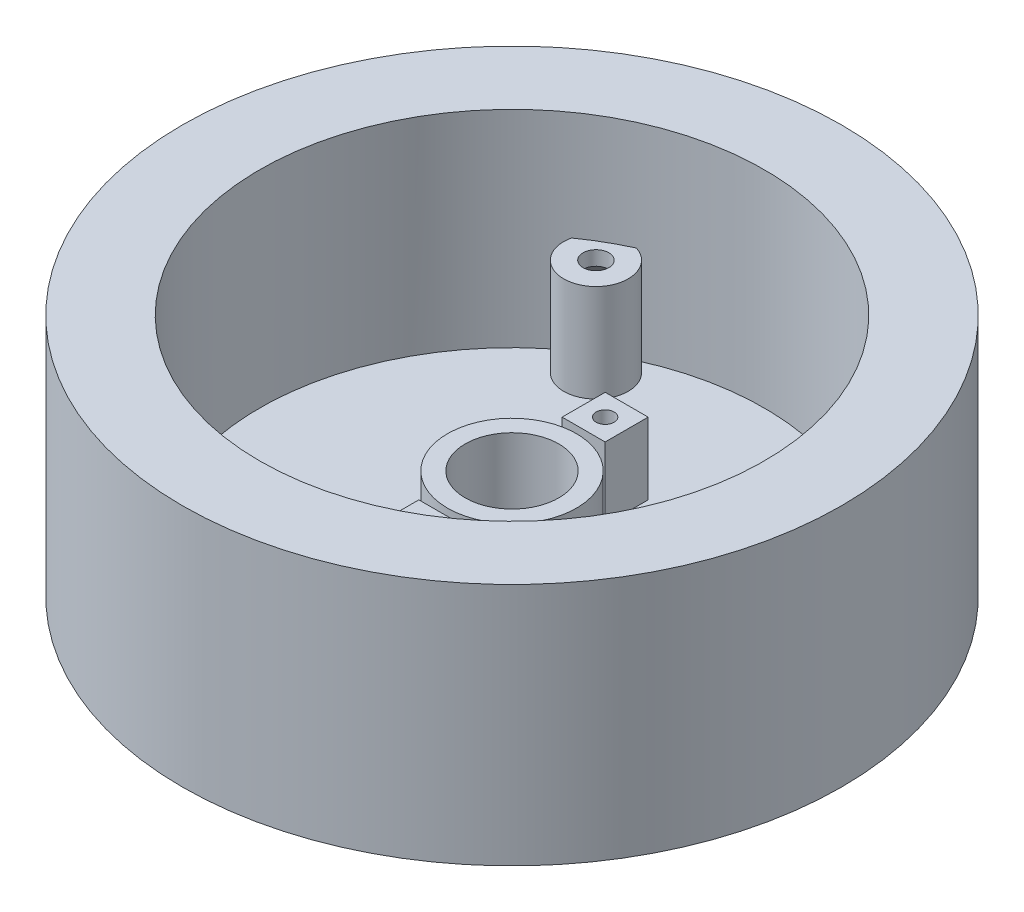
ISO-10303-21;
HEADER;
FILE_DESCRIPTION(('STEP AP214'),'2;1');
FILE_NAME('part.step','',(''),(''),'','','');
FILE_SCHEMA(('AUTOMOTIVE_DESIGN { 1 0 10303 214 1 1 1 1 }'));
ENDSEC;
DATA;
#1=APPLICATION_CONTEXT('core data for automotive mechanical design processes');
#2=APPLICATION_PROTOCOL_DEFINITION('international standard','automotive_design',2000,#1);
#3=PRODUCT_CONTEXT('',#1,'mechanical');
#4=PRODUCT('Part','Part','',(#3));
#5=PRODUCT_RELATED_PRODUCT_CATEGORY('part','',(#4));
#6=PRODUCT_DEFINITION_FORMATION('','',#4);
#7=PRODUCT_DEFINITION_CONTEXT('part definition',#1,'design');
#8=PRODUCT_DEFINITION('design','',#6,#7);
#9=PRODUCT_DEFINITION_SHAPE('','',#8);
#10=(LENGTH_UNIT() NAMED_UNIT(*) SI_UNIT(.MILLI.,.METRE.));
#11=(NAMED_UNIT(*) PLANE_ANGLE_UNIT() SI_UNIT($,.RADIAN.));
#12=(NAMED_UNIT(*) SI_UNIT($,.STERADIAN.) SOLID_ANGLE_UNIT());
#13=UNCERTAINTY_MEASURE_WITH_UNIT(LENGTH_MEASURE(1.E-05),#10,'distance_accuracy_value','');
#14=(GEOMETRIC_REPRESENTATION_CONTEXT(3) GLOBAL_UNCERTAINTY_ASSIGNED_CONTEXT((#13)) GLOBAL_UNIT_ASSIGNED_CONTEXT((#10,
#11,#12)) REPRESENTATION_CONTEXT('',''));
#15=CARTESIAN_POINT('',(0.,0.,0.));
#16=DIRECTION('',(0.,0.,1.));
#17=DIRECTION('',(1.,0.,0.));
#18=AXIS2_PLACEMENT_3D('',#15,#16,#17);
#19=CARTESIAN_POINT('',(0.,74.6999133448223,0.));
#20=DIRECTION('',(0.,-1.,0.));
#21=DIRECTION('',(0.,0.,-1.));
#22=AXIS2_PLACEMENT_3D('',#19,#20,#21);
#23=CYLINDRICAL_SURFACE('',#22,17.6);
#24=CARTESIAN_POINT('',(0.,17.,0.));
#25=DIRECTION('',(0.,1.,0.));
#26=DIRECTION('',(0.,0.,1.));
#27=AXIS2_PLACEMENT_3D('',#24,#25,#26);
#28=CIRCLE('',#27,17.6);
#29=CARTESIAN_POINT('',(0.,17.,17.6));
#30=VERTEX_POINT('',#29);
#31=EDGE_CURVE('E228',#30,#30,#28,.T.);
#32=ORIENTED_EDGE('',*,*,#31,.T.);
#33=EDGE_LOOP('',(#32));
#34=FACE_BOUND('',#33,.T.);
#35=CARTESIAN_POINT('',(0.,9.40000000000001,0.));
#36=DIRECTION('',(0.,1.,0.));
#37=DIRECTION('',(0.,0.,1.));
#38=AXIS2_PLACEMENT_3D('',#35,#36,#37);
#39=CIRCLE('',#38,17.6);
#40=CARTESIAN_POINT('',(-10.1961599828031,9.4,14.3456725741627));
#41=VERTEX_POINT('',#40);
#42=CARTESIAN_POINT('',(-7.32563689219481,9.4,16.0029698532402));
#43=VERTEX_POINT('',#42);
#44=EDGE_CURVE('E12',#41,#43,#39,.T.);
#45=ORIENTED_EDGE('',*,*,#44,.F.);
#46=DIRECTION('',(0.,-1.,0.));
#47=VECTOR('',#46,1.);
#48=CARTESIAN_POINT('',(-10.1961599828031,6.,14.3456725741627));
#49=LINE('',#48,#47);
#50=CARTESIAN_POINT('',(-10.1961599828031,2.6,14.3456725741627));
#51=VERTEX_POINT('',#50);
#52=EDGE_CURVE('E149',#41,#51,#49,.T.);
#53=ORIENTED_EDGE('',*,*,#52,.T.);
#54=CARTESIAN_POINT('',(0.,2.6,0.));
#55=DIRECTION('',(0.,1.,0.));
#56=DIRECTION('',(0.,0.,1.));
#57=AXIS2_PLACEMENT_3D('',#54,#55,#56);
#58=CIRCLE('',#57,17.6);
#59=CARTESIAN_POINT('',(-10.1961599828047,2.6,-14.3456725741616));
#60=VERTEX_POINT('',#59);
#61=EDGE_CURVE('E159',#51,#60,#58,.F.);
#62=ORIENTED_EDGE('',*,*,#61,.T.);
#63=DIRECTION('',(0.,-1.,0.));
#64=VECTOR('',#63,1.);
#65=CARTESIAN_POINT('',(-10.1961599828047,6.,-14.3456725741616));
#66=LINE('',#65,#64);
#67=CARTESIAN_POINT('',(-10.1961599828047,9.4,-14.3456725741616));
#68=VERTEX_POINT('',#67);
#69=EDGE_CURVE('E180',#60,#68,#66,.F.);
#70=ORIENTED_EDGE('',*,*,#69,.T.);
#71=CARTESIAN_POINT('',(0.,9.40000000000001,0.));
#72=DIRECTION('',(0.,1.,0.));
#73=DIRECTION('',(0.,0.,1.));
#74=AXIS2_PLACEMENT_3D('',#71,#72,#73);
#75=CIRCLE('',#74,17.6);
#76=CARTESIAN_POINT('',(-7.32563689219546,9.4,-16.0029698532399));
#77=VERTEX_POINT('',#76);
#78=EDGE_CURVE('E178',#77,#68,#75,.T.);
#79=ORIENTED_EDGE('',*,*,#78,.F.);
#80=DIRECTION('',(0.,-1.,0.));
#81=VECTOR('',#80,1.);
#82=CARTESIAN_POINT('',(-7.32563689219548,6.,-16.0029698532399));
#83=LINE('',#82,#81);
#84=CARTESIAN_POINT('',(-7.32563689219546,2.6,-16.0029698532399));
#85=VERTEX_POINT('',#84);
#86=EDGE_CURVE('E184',#77,#85,#83,.T.);
#87=ORIENTED_EDGE('',*,*,#86,.T.);
#88=CARTESIAN_POINT('',(17.5217968749998,2.6,-1.65729727908006));
#89=VERTEX_POINT('',#88);
#90=EDGE_CURVE('E171',#85,#89,#58,.F.);
#91=ORIENTED_EDGE('',*,*,#90,.T.);
#92=DIRECTION('',(0.,-1.,0.));
#93=VECTOR('',#92,1.);
#94=CARTESIAN_POINT('',(17.5217968749998,6.,-1.65729727908007));
#95=LINE('',#94,#93);
#96=CARTESIAN_POINT('',(17.5217968749998,9.4,-1.65729727908008));
#97=VERTEX_POINT('',#96);
#98=EDGE_CURVE('E70',#89,#97,#95,.F.);
#99=ORIENTED_EDGE('',*,*,#98,.T.);
#100=CARTESIAN_POINT('',(0.,9.40000000000001,0.));
#101=DIRECTION('',(0.,1.,0.));
#102=DIRECTION('',(0.,0.,1.));
#103=AXIS2_PLACEMENT_3D('',#100,#101,#102);
#104=CIRCLE('',#103,17.6);
#105=CARTESIAN_POINT('',(17.5217968750001,9.4,1.65729727907769));
#106=VERTEX_POINT('',#105);
#107=EDGE_CURVE('E54',#106,#97,#104,.T.);
#108=ORIENTED_EDGE('',*,*,#107,.F.);
#109=DIRECTION('',(0.,-1.,0.));
#110=VECTOR('',#109,1.);
#111=CARTESIAN_POINT('',(17.5217968750001,6.,1.65729727907768));
#112=LINE('',#111,#110);
#113=CARTESIAN_POINT('',(17.5217968750001,2.6,1.65729727907768));
#114=VERTEX_POINT('',#113);
#115=EDGE_CURVE('E222',#106,#114,#112,.T.);
#116=ORIENTED_EDGE('',*,*,#115,.T.);
#117=CARTESIAN_POINT('',(-7.32563689219484,2.6,16.0029698532402));
#118=VERTEX_POINT('',#117);
#119=EDGE_CURVE('E168',#114,#118,#58,.F.);
#120=ORIENTED_EDGE('',*,*,#119,.T.);
#121=DIRECTION('',(0.,-1.,0.));
#122=VECTOR('',#121,1.);
#123=CARTESIAN_POINT('',(-7.32563689219483,6.,16.0029698532402));
#124=LINE('',#123,#122);
#125=EDGE_CURVE('E62',#118,#43,#124,.F.);
#126=ORIENTED_EDGE('',*,*,#125,.T.);
#127=EDGE_LOOP('',(#45,#53,#62,#70,#79,#87,#91,#99,#108,#116,#120,#126));
#128=FACE_BOUND('',#127,.T.);
#129=ADVANCED_FACE('F45',(#34,#128),#23,.F.);
#130=CARTESIAN_POINT('',(0.,2.6,0.));
#131=DIRECTION('',(0.,1.,0.));
#132=DIRECTION('',(0.,0.,1.));
#133=AXIS2_PLACEMENT_3D('',#130,#131,#132);
#134=PLANE('',#133);
#135=DIRECTION('',(0.,0.,-1.));
#136=VECTOR('',#135,1.);
#137=CARTESIAN_POINT('',(1.5,2.6,0.));
#138=LINE('',#137,#136);
#139=CARTESIAN_POINT('',(1.5,2.6,7.99795173081583));
#140=VERTEX_POINT('',#139);
#141=CARTESIAN_POINT('',(1.5,2.6,4.99795173081583));
#142=VERTEX_POINT('',#141);
#143=EDGE_CURVE('E286',#140,#142,#138,.T.);
#144=ORIENTED_EDGE('',*,*,#143,.F.);
#145=DIRECTION('',(1.,0.,0.));
#146=VECTOR('',#145,1.);
#147=CARTESIAN_POINT('',(0.,2.6,7.99795173081583));
#148=LINE('',#147,#146);
#149=CARTESIAN_POINT('',(-1.5,2.6,7.99795173081583));
#150=VERTEX_POINT('',#149);
#151=EDGE_CURVE('E267',#150,#140,#148,.T.);
#152=ORIENTED_EDGE('',*,*,#151,.F.);
#153=DIRECTION('',(0.,0.,-1.));
#154=VECTOR('',#153,1.);
#155=CARTESIAN_POINT('',(-1.5,2.6,0.));
#156=LINE('',#155,#154);
#157=CARTESIAN_POINT('',(-1.5,2.6,4.99795173081583));
#158=VERTEX_POINT('',#157);
#159=EDGE_CURVE('E272',#150,#158,#156,.T.);
#160=ORIENTED_EDGE('',*,*,#159,.T.);
#161=DIRECTION('',(1.,0.,0.));
#162=VECTOR('',#161,1.);
#163=CARTESIAN_POINT('',(0.,2.6,4.99795173081583));
#164=LINE('',#163,#162);
#165=EDGE_CURVE('E289',#158,#142,#164,.T.);
#166=ORIENTED_EDGE('',*,*,#165,.T.);
#167=EDGE_LOOP('',(#144,#152,#160,#166));
#168=FACE_BOUND('',#167,.T.);
#169=CARTESIAN_POINT('',(0.,2.6,0.));
#170=DIRECTION('',(0.,1.,0.));
#171=DIRECTION('',(0.,0.,1.));
#172=AXIS2_PLACEMENT_3D('',#169,#170,#171);
#173=CIRCLE('',#172,4.5);
#174=CARTESIAN_POINT('',(0.,2.6,4.5));
#175=VERTEX_POINT('',#174);
#176=EDGE_CURVE('E313',#175,#175,#173,.T.);
#177=ORIENTED_EDGE('',*,*,#176,.F.);
#178=EDGE_LOOP('',(#177));
#179=FACE_BOUND('',#178,.T.);
#180=DIRECTION('',(1.,0.,0.));
#181=VECTOR('',#180,1.);
#182=CARTESIAN_POINT('',(0.,2.6,-7.99795173081583));
#183=LINE('',#182,#181);
#184=CARTESIAN_POINT('',(-1.5,2.6,-7.99795173081583));
#185=VERTEX_POINT('',#184);
#186=CARTESIAN_POINT('',(1.5,2.6,-7.99795173081583));
#187=VERTEX_POINT('',#186);
#188=EDGE_CURVE('E231',#185,#187,#183,.T.);
#189=ORIENTED_EDGE('',*,*,#188,.T.);
#190=DIRECTION('',(0.,0.,1.));
#191=VECTOR('',#190,1.);
#192=CARTESIAN_POINT('',(1.5,2.6,0.));
#193=LINE('',#192,#191);
#194=CARTESIAN_POINT('',(1.5,2.6,-4.99795173081583));
#195=VERTEX_POINT('',#194);
#196=EDGE_CURVE('E236',#187,#195,#193,.T.);
#197=ORIENTED_EDGE('',*,*,#196,.T.);
#198=DIRECTION('',(1.,0.,0.));
#199=VECTOR('',#198,1.);
#200=CARTESIAN_POINT('',(0.,2.6,-4.99795173081583));
#201=LINE('',#200,#199);
#202=CARTESIAN_POINT('',(-1.5,2.6,-4.99795173081583));
#203=VERTEX_POINT('',#202);
#204=EDGE_CURVE('E252',#203,#195,#201,.T.);
#205=ORIENTED_EDGE('',*,*,#204,.F.);
#206=DIRECTION('',(0.,0.,1.));
#207=VECTOR('',#206,1.);
#208=CARTESIAN_POINT('',(-1.5,2.6,0.));
#209=LINE('',#208,#207);
#210=EDGE_CURVE('E249',#185,#203,#209,.T.);
#211=ORIENTED_EDGE('',*,*,#210,.F.);
#212=EDGE_LOOP('',(#189,#197,#205,#211));
#213=FACE_BOUND('',#212,.T.);
#214=ORIENTED_EDGE('',*,*,#61,.F.);
#215=CARTESIAN_POINT('',(-7.99999999999875,2.6,13.8564064605511));
#216=DIRECTION('',(0.,1.,0.));
#217=DIRECTION('',(0.,0.,1.));
#218=AXIS2_PLACEMENT_3D('',#215,#216,#217);
#219=CIRCLE('',#218,2.25);
#220=EDGE_CURVE('E146',#118,#51,#219,.T.);
#221=ORIENTED_EDGE('',*,*,#220,.F.);
#222=ORIENTED_EDGE('',*,*,#119,.F.);
#223=CARTESIAN_POINT('',(16.0000000000006,2.6,-1.09033358239092E-12));
#224=DIRECTION('',(0.,1.,0.));
#225=DIRECTION('',(0.,0.,1.));
#226=AXIS2_PLACEMENT_3D('',#223,#224,#225);
#227=CIRCLE('',#226,2.25);
#228=EDGE_CURVE('E188',#114,#89,#227,.F.);
#229=ORIENTED_EDGE('',*,*,#228,.T.);
#230=ORIENTED_EDGE('',*,*,#90,.F.);
#231=CARTESIAN_POINT('',(-8.00000000000007,2.6,-13.856406460551));
#232=DIRECTION('',(0.,1.,0.));
#233=DIRECTION('',(0.,0.,1.));
#234=AXIS2_PLACEMENT_3D('',#231,#232,#233);
#235=CIRCLE('',#234,2.25);
#236=EDGE_CURVE('E166',#60,#85,#235,.T.);
#237=ORIENTED_EDGE('',*,*,#236,.F.);
#238=EDGE_LOOP('',(#214,#221,#222,#229,#230,#237));
#239=FACE_BOUND('',#238,.T.);
#240=ADVANCED_FACE('F163',(#168,#179,#213,#239),#134,.T.);
#241=CARTESIAN_POINT('',(0.,17.,0.));
#242=DIRECTION('',(0.,-1.,0.));
#243=DIRECTION('',(0.,0.,-1.));
#244=AXIS2_PLACEMENT_3D('',#241,#242,#243);
#245=CYLINDRICAL_SURFACE('',#244,23.);
#246=CARTESIAN_POINT('',(0.,17.,0.));
#247=DIRECTION('',(0.,1.,0.));
#248=DIRECTION('',(0.,0.,1.));
#249=AXIS2_PLACEMENT_3D('',#246,#247,#248);
#250=CIRCLE('',#249,23.);
#251=CARTESIAN_POINT('',(0.,17.,23.));
#252=VERTEX_POINT('',#251);
#253=EDGE_CURVE('E169',#252,#252,#250,.T.);
#254=ORIENTED_EDGE('',*,*,#253,.F.);
#255=EDGE_LOOP('',(#254));
#256=FACE_BOUND('',#255,.T.);
#257=CARTESIAN_POINT('',(0.,0.,0.));
#258=DIRECTION('',(0.,1.,0.));
#259=DIRECTION('',(0.,0.,1.));
#260=AXIS2_PLACEMENT_3D('',#257,#258,#259);
#261=CIRCLE('',#260,23.);
#262=CARTESIAN_POINT('',(0.,0.,23.));
#263=VERTEX_POINT('',#262);
#264=EDGE_CURVE('E173',#263,#263,#261,.T.);
#265=ORIENTED_EDGE('',*,*,#264,.T.);
#266=EDGE_LOOP('',(#265));
#267=FACE_BOUND('',#266,.T.);
#268=ADVANCED_FACE('F47',(#256,#267),#245,.T.);
#269=CARTESIAN_POINT('',(0.,17.,0.));
#270=DIRECTION('',(0.,1.,0.));
#271=DIRECTION('',(0.,0.,1.));
#272=AXIS2_PLACEMENT_3D('',#269,#270,#271);
#273=PLANE('',#272);
#274=ORIENTED_EDGE('',*,*,#253,.T.);
#275=EDGE_LOOP('',(#274));
#276=FACE_BOUND('',#275,.T.);
#277=ORIENTED_EDGE('',*,*,#31,.F.);
#278=EDGE_LOOP('',(#277));
#279=FACE_BOUND('',#278,.T.);
#280=ADVANCED_FACE('F327',(#276,#279),#273,.T.);
#281=CARTESIAN_POINT('',(0.,0.,0.));
#282=DIRECTION('',(0.,1.,0.));
#283=DIRECTION('',(0.,0.,1.));
#284=AXIS2_PLACEMENT_3D('',#281,#282,#283);
#285=PLANE('',#284);
#286=CARTESIAN_POINT('',(-7.99999999999987,0.,13.8564064605511));
#287=DIRECTION('',(0.,-1.,0.));
#288=DIRECTION('',(0.,0.,-1.));
#289=AXIS2_PLACEMENT_3D('',#286,#287,#288);
#290=CIRCLE('',#289,1.8);
#291=CARTESIAN_POINT('',(-7.99999999999987,0.,12.0564064605511));
#292=VERTEX_POINT('',#291);
#293=EDGE_CURVE('E786',#292,#292,#290,.T.);
#294=ORIENTED_EDGE('',*,*,#293,.F.);
#295=EDGE_LOOP('',(#294));
#296=FACE_BOUND('',#295,.T.);
#297=CARTESIAN_POINT('',(-8.00000000000007,0.,-13.856406460551));
#298=DIRECTION('',(0.,-1.,0.));
#299=DIRECTION('',(0.,0.,-1.));
#300=AXIS2_PLACEMENT_3D('',#297,#298,#299);
#301=CIRCLE('',#300,1.8);
#302=CARTESIAN_POINT('',(-8.00000000000007,0.,-15.656406460551));
#303=VERTEX_POINT('',#302);
#304=EDGE_CURVE('E209',#303,#303,#301,.T.);
#305=ORIENTED_EDGE('',*,*,#304,.F.);
#306=EDGE_LOOP('',(#305));
#307=FACE_BOUND('',#306,.T.);
#308=CARTESIAN_POINT('',(16.,0.,0.));
#309=DIRECTION('',(0.,-1.,0.));
#310=DIRECTION('',(0.,0.,-1.));
#311=AXIS2_PLACEMENT_3D('',#308,#309,#310);
#312=CIRCLE('',#311,1.8);
#313=CARTESIAN_POINT('',(16.,0.,-1.8));
#314=VERTEX_POINT('',#313);
#315=EDGE_CURVE('E196',#314,#314,#312,.T.);
#316=ORIENTED_EDGE('',*,*,#315,.F.);
#317=EDGE_LOOP('',(#316));
#318=FACE_BOUND('',#317,.T.);
#319=CARTESIAN_POINT('',(0.,0.,-6.49795173081583));
#320=DIRECTION('',(0.,-1.,0.));
#321=DIRECTION('',(0.,0.,-1.));
#322=AXIS2_PLACEMENT_3D('',#319,#320,#321);
#323=CIRCLE('',#322,0.624999999999988);
#324=CARTESIAN_POINT('',(0.,0.,-7.12295173081582));
#325=VERTEX_POINT('',#324);
#326=EDGE_CURVE('E303',#325,#325,#323,.T.);
#327=ORIENTED_EDGE('',*,*,#326,.F.);
#328=EDGE_LOOP('',(#327));
#329=FACE_BOUND('',#328,.T.);
#330=CARTESIAN_POINT('',(0.,0.,6.49795173081583));
#331=DIRECTION('',(0.,-1.,0.));
#332=DIRECTION('',(0.,0.,-1.));
#333=AXIS2_PLACEMENT_3D('',#330,#331,#332);
#334=CIRCLE('',#333,0.624999999999988);
#335=CARTESIAN_POINT('',(0.,0.,5.87295173081584));
#336=VERTEX_POINT('',#335);
#337=EDGE_CURVE('E306',#336,#336,#334,.T.);
#338=ORIENTED_EDGE('',*,*,#337,.F.);
#339=EDGE_LOOP('',(#338));
#340=FACE_BOUND('',#339,.T.);
#341=CARTESIAN_POINT('',(0.,0.,0.));
#342=DIRECTION('',(0.,1.,0.));
#343=DIRECTION('',(0.,0.,1.));
#344=AXIS2_PLACEMENT_3D('',#341,#342,#343);
#345=CIRCLE('',#344,3.265);
#346=CARTESIAN_POINT('',(0.,0.,3.265));
#347=VERTEX_POINT('',#346);
#348=EDGE_CURVE('E310',#347,#347,#345,.T.);
#349=ORIENTED_EDGE('',*,*,#348,.T.);
#350=EDGE_LOOP('',(#349));
#351=FACE_BOUND('',#350,.T.);
#352=ORIENTED_EDGE('',*,*,#264,.F.);
#353=EDGE_LOOP('',(#352));
#354=FACE_BOUND('',#353,.T.);
#355=ADVANCED_FACE('F324',(#296,#307,#318,#329,#340,#351,#354),#285,.F.);
#356=CARTESIAN_POINT('',(0.,7.6,0.));
#357=DIRECTION('',(0.,-1.,0.));
#358=DIRECTION('',(0.,0.,-1.));
#359=AXIS2_PLACEMENT_3D('',#356,#357,#358);
#360=CYLINDRICAL_SURFACE('',#359,4.5);
#361=CARTESIAN_POINT('',(0.,7.6,0.));
#362=DIRECTION('',(0.,1.,0.));
#363=DIRECTION('',(0.,0.,1.));
#364=AXIS2_PLACEMENT_3D('',#361,#362,#363);
#365=CIRCLE('',#364,4.5);
#366=CARTESIAN_POINT('',(0.,7.6,4.5));
#367=VERTEX_POINT('',#366);
#368=EDGE_CURVE('E316',#367,#367,#365,.T.);
#369=ORIENTED_EDGE('',*,*,#368,.F.);
#370=EDGE_LOOP('',(#369));
#371=FACE_BOUND('',#370,.T.);
#372=ORIENTED_EDGE('',*,*,#176,.T.);
#373=EDGE_LOOP('',(#372));
#374=FACE_BOUND('',#373,.T.);
#375=ADVANCED_FACE('F326',(#371,#374),#360,.T.);
#376=CARTESIAN_POINT('',(0.,7.6,0.));
#377=DIRECTION('',(0.,1.,0.));
#378=DIRECTION('',(0.,0.,1.));
#379=AXIS2_PLACEMENT_3D('',#376,#377,#378);
#380=PLANE('',#379);
#381=CARTESIAN_POINT('',(0.,7.6,0.));
#382=DIRECTION('',(0.,1.,0.));
#383=DIRECTION('',(0.,0.,1.));
#384=AXIS2_PLACEMENT_3D('',#381,#382,#383);
#385=CIRCLE('',#384,3.265);
#386=CARTESIAN_POINT('',(0.,7.6,3.265));
#387=VERTEX_POINT('',#386);
#388=EDGE_CURVE('E309',#387,#387,#385,.T.);
#389=ORIENTED_EDGE('',*,*,#388,.F.);
#390=EDGE_LOOP('',(#389));
#391=FACE_BOUND('',#390,.T.);
#392=ORIENTED_EDGE('',*,*,#368,.T.);
#393=EDGE_LOOP('',(#392));
#394=FACE_BOUND('',#393,.T.);
#395=ADVANCED_FACE('F333',(#391,#394),#380,.T.);
#396=CARTESIAN_POINT('',(0.,0.,0.));
#397=DIRECTION('',(0.,1.,0.));
#398=DIRECTION('',(0.,0.,1.));
#399=AXIS2_PLACEMENT_3D('',#396,#397,#398);
#400=CYLINDRICAL_SURFACE('',#399,3.265);
#401=CARTESIAN_POINT('',(0.,0.,3.265));
#402=CARTESIAN_POINT('',(0.,0.0791666666666666,3.265));
#403=CARTESIAN_POINT('',(0.,0.158333333333333,3.265));
#404=CARTESIAN_POINT('',(0.,0.316666666666667,3.265));
#405=CARTESIAN_POINT('',(0.,0.395833333333333,3.265));
#406=CARTESIAN_POINT('',(0.,0.554166666666667,3.265));
#407=CARTESIAN_POINT('',(0.,0.633333333333333,3.265));
#408=CARTESIAN_POINT('',(0.,0.791666666666667,3.265));
#409=CARTESIAN_POINT('',(0.,0.870833333333333,3.265));
#410=CARTESIAN_POINT('',(0.,1.02916666666667,3.265));
#411=CARTESIAN_POINT('',(0.,1.10833333333333,3.265));
#412=CARTESIAN_POINT('',(0.,1.26666666666667,3.265));
#413=CARTESIAN_POINT('',(0.,1.34583333333333,3.265));
#414=CARTESIAN_POINT('',(0.,1.50416666666667,3.265));
#415=CARTESIAN_POINT('',(0.,1.58333333333333,3.265));
#416=CARTESIAN_POINT('',(0.,1.74166666666667,3.265));
#417=CARTESIAN_POINT('',(0.,1.82083333333333,3.265));
#418=CARTESIAN_POINT('',(0.,1.97916666666667,3.265));
#419=CARTESIAN_POINT('',(0.,2.05833333333333,3.265));
#420=CARTESIAN_POINT('',(0.,2.21666666666667,3.265));
#421=CARTESIAN_POINT('',(0.,2.29583333333333,3.265));
#422=CARTESIAN_POINT('',(0.,2.45416666666667,3.265));
#423=CARTESIAN_POINT('',(0.,2.53333333333333,3.265));
#424=CARTESIAN_POINT('',(0.,2.69166666666667,3.265));
#425=CARTESIAN_POINT('',(0.,2.77083333333333,3.265));
#426=CARTESIAN_POINT('',(0.,2.92916666666667,3.265));
#427=CARTESIAN_POINT('',(0.,3.00833333333333,3.265));
#428=CARTESIAN_POINT('',(0.,3.16666666666667,3.265));
#429=CARTESIAN_POINT('',(0.,3.24583333333333,3.265));
#430=CARTESIAN_POINT('',(0.,3.40416666666667,3.265));
#431=CARTESIAN_POINT('',(0.,3.48333333333333,3.265));
#432=CARTESIAN_POINT('',(0.,3.64166666666667,3.265));
#433=CARTESIAN_POINT('',(0.,3.72083333333333,3.265));
#434=CARTESIAN_POINT('',(0.,3.87916666666667,3.265));
#435=CARTESIAN_POINT('',(0.,3.95833333333333,3.265));
#436=CARTESIAN_POINT('',(0.,4.11666666666667,3.265));
#437=CARTESIAN_POINT('',(0.,4.19583333333333,3.265));
#438=CARTESIAN_POINT('',(0.,4.35416666666667,3.265));
#439=CARTESIAN_POINT('',(0.,4.43333333333333,3.265));
#440=CARTESIAN_POINT('',(0.,4.59166666666667,3.265));
#441=CARTESIAN_POINT('',(0.,4.67083333333333,3.265));
#442=CARTESIAN_POINT('',(0.,4.82916666666667,3.265));
#443=CARTESIAN_POINT('',(0.,4.90833333333333,3.265));
#444=CARTESIAN_POINT('',(0.,5.06666666666667,3.265));
#445=CARTESIAN_POINT('',(0.,5.14583333333333,3.265));
#446=CARTESIAN_POINT('',(0.,5.30416666666667,3.265));
#447=CARTESIAN_POINT('',(0.,5.38333333333333,3.265));
#448=CARTESIAN_POINT('',(0.,5.54166666666667,3.265));
#449=CARTESIAN_POINT('',(0.,5.62083333333333,3.265));
#450=CARTESIAN_POINT('',(0.,5.77916666666667,3.265));
#451=CARTESIAN_POINT('',(0.,5.85833333333333,3.265));
#452=CARTESIAN_POINT('',(0.,6.01666666666667,3.265));
#453=CARTESIAN_POINT('',(0.,6.09583333333333,3.265));
#454=CARTESIAN_POINT('',(0.,6.25416666666667,3.265));
#455=CARTESIAN_POINT('',(0.,6.33333333333333,3.265));
#456=CARTESIAN_POINT('',(0.,6.49166666666667,3.265));
#457=CARTESIAN_POINT('',(0.,6.57083333333333,3.265));
#458=CARTESIAN_POINT('',(0.,6.72916666666667,3.265));
#459=CARTESIAN_POINT('',(0.,6.80833333333333,3.265));
#460=CARTESIAN_POINT('',(0.,6.96666666666667,3.265));
#461=CARTESIAN_POINT('',(0.,7.04583333333333,3.265));
#462=CARTESIAN_POINT('',(0.,7.20416666666667,3.265));
#463=CARTESIAN_POINT('',(0.,7.28333333333333,3.265));
#464=CARTESIAN_POINT('',(0.,7.44166666666667,3.265));
#465=CARTESIAN_POINT('',(0.,7.52083333333333,3.265));
#466=CARTESIAN_POINT('',(0.,7.6,3.265));
#467=B_SPLINE_CURVE_WITH_KNOTS('',3,(#401,#402,#403,#404,#405,#406,#407,#408,#409,#410,#411,
#412,#413,#414,#415,#416,#417,#418,#419,#420,#421,#422,#423,#424,#425,#426,#427,#428,#429,#430,
#431,#432,#433,#434,#435,#436,#437,#438,#439,#440,#441,#442,#443,#444,#445,#446,#447,#448,#449,
#450,#451,#452,#453,#454,#455,#456,#457,#458,#459,#460,#461,#462,#463,#464,#465,#466),
.UNSPECIFIED.,.F.,.F.,(4,2,2,2,2,2,2,2,2,2,2,2,2,2,2,2,2,2,2,2,2,2,2,2,2,2,2,2,2,2,2,2,4),(0.,
0.2375,0.475,0.7125,0.95,1.1875,1.425,1.6625,1.9,2.1375,2.375,2.6125,2.85,3.0875,3.325,3.5625,
3.8,4.0375,4.275,4.5125,4.75,4.9875,5.225,5.4625,5.7,5.9375,6.175,6.4125,6.65,6.8875,7.125,
7.3625,7.6),.UNSPECIFIED.);
#468=EDGE_CURVE('BSEAM399',#347,#387,#467,.T.);
#469=ORIENTED_EDGE('',*,*,#348,.F.);
#470=ORIENTED_EDGE('',*,*,#388,.T.);
#471=ORIENTED_EDGE('',*,*,#468,.T.);
#472=ORIENTED_EDGE('',*,*,#468,.F.);
#473=EDGE_LOOP('',(#469,#471,#470,#472));
#474=FACE_BOUND('',#473,.T.);
#475=ADVANCED_FACE('F399',(#474),#400,.F.);
#476=CARTESIAN_POINT('',(0.,0.,6.49795173081583));
#477=DIRECTION('',(0.,-1.,0.));
#478=DIRECTION('',(0.,0.,-1.));
#479=AXIS2_PLACEMENT_3D('',#476,#477,#478);
#480=CYLINDRICAL_SURFACE('',#479,0.624999999999987);
#481=ORIENTED_EDGE('',*,*,#337,.T.);
#482=EDGE_LOOP('',(#481));
#483=FACE_BOUND('',#482,.T.);
#484=CARTESIAN_POINT('',(0.,7.6,6.49795173081583));
#485=DIRECTION('',(0.,1.,0.));
#486=DIRECTION('',(0.,0.,1.));
#487=AXIS2_PLACEMENT_3D('',#484,#485,#486);
#488=CIRCLE('',#487,0.624999999999987);
#489=CARTESIAN_POINT('',(0.,7.6,7.12295173081582));
#490=VERTEX_POINT('',#489);
#491=EDGE_CURVE('E268',#490,#490,#488,.F.);
#492=ORIENTED_EDGE('',*,*,#491,.F.);
#493=EDGE_LOOP('',(#492));
#494=FACE_BOUND('',#493,.T.);
#495=ADVANCED_FACE('F395',(#483,#494),#480,.F.);
#496=CARTESIAN_POINT('',(0.,0.,-6.49795173081583));
#497=DIRECTION('',(0.,-1.,0.));
#498=DIRECTION('',(0.,0.,-1.));
#499=AXIS2_PLACEMENT_3D('',#496,#497,#498);
#500=CYLINDRICAL_SURFACE('',#499,0.624999999999987);
#501=ORIENTED_EDGE('',*,*,#326,.T.);
#502=EDGE_LOOP('',(#501));
#503=FACE_BOUND('',#502,.T.);
#504=CARTESIAN_POINT('',(0.,7.6,-6.49795173081583));
#505=DIRECTION('',(0.,1.,0.));
#506=DIRECTION('',(0.,0.,1.));
#507=AXIS2_PLACEMENT_3D('',#504,#505,#506);
#508=CIRCLE('',#507,0.624999999999987);
#509=CARTESIAN_POINT('',(0.,7.6,-5.87295173081585));
#510=VERTEX_POINT('',#509);
#511=EDGE_CURVE('E232',#510,#510,#508,.F.);
#512=ORIENTED_EDGE('',*,*,#511,.F.);
#513=EDGE_LOOP('',(#512));
#514=FACE_BOUND('',#513,.T.);
#515=ADVANCED_FACE('F391',(#503,#514),#500,.F.);
#516=CARTESIAN_POINT('',(0.,7.6,7.99795173081583));
#517=DIRECTION('',(0.,0.,-1.));
#518=DIRECTION('',(-1.,0.,0.));
#519=AXIS2_PLACEMENT_3D('',#516,#517,#518);
#520=PLANE('',#519);
#521=ORIENTED_EDGE('',*,*,#151,.T.);
#522=DIRECTION('',(0.,-1.,0.));
#523=VECTOR('',#522,1.);
#524=CARTESIAN_POINT('',(1.5,7.6,7.99795173081583));
#525=LINE('',#524,#523);
#526=CARTESIAN_POINT('',(1.5,7.6,7.99795173081583));
#527=VERTEX_POINT('',#526);
#528=EDGE_CURVE('E300',#527,#140,#525,.T.);
#529=ORIENTED_EDGE('',*,*,#528,.F.);
#530=DIRECTION('',(1.,0.,0.));
#531=VECTOR('',#530,1.);
#532=CARTESIAN_POINT('',(0.,7.6,7.99795173081583));
#533=LINE('',#532,#531);
#534=CARTESIAN_POINT('',(-1.5,7.6,7.99795173081583));
#535=VERTEX_POINT('',#534);
#536=EDGE_CURVE('E271',#535,#527,#533,.T.);
#537=ORIENTED_EDGE('',*,*,#536,.F.);
#538=DIRECTION('',(0.,-1.,0.));
#539=VECTOR('',#538,1.);
#540=CARTESIAN_POINT('',(-1.5,7.6,7.99795173081583));
#541=LINE('',#540,#539);
#542=EDGE_CURVE('E283',#535,#150,#541,.T.);
#543=ORIENTED_EDGE('',*,*,#542,.T.);
#544=EDGE_LOOP('',(#521,#529,#537,#543));
#545=FACE_BOUND('',#544,.T.);
#546=ADVANCED_FACE('F387',(#545),#520,.F.);
#547=CARTESIAN_POINT('',(1.5,7.6,0.));
#548=DIRECTION('',(-1.,0.,0.));
#549=DIRECTION('',(0.,0.,1.));
#550=AXIS2_PLACEMENT_3D('',#547,#548,#549);
#551=PLANE('',#550);
#552=ORIENTED_EDGE('',*,*,#143,.T.);
#553=DIRECTION('',(0.,-1.,0.));
#554=VECTOR('',#553,1.);
#555=CARTESIAN_POINT('',(1.5,7.6,4.99795173081583));
#556=LINE('',#555,#554);
#557=CARTESIAN_POINT('',(1.5,7.6,4.99795173081583));
#558=VERTEX_POINT('',#557);
#559=EDGE_CURVE('E297',#558,#142,#556,.T.);
#560=ORIENTED_EDGE('',*,*,#559,.F.);
#561=DIRECTION('',(0.,0.,-1.));
#562=VECTOR('',#561,1.);
#563=CARTESIAN_POINT('',(1.5,7.6,0.));
#564=LINE('',#563,#562);
#565=EDGE_CURVE('E275',#527,#558,#564,.T.);
#566=ORIENTED_EDGE('',*,*,#565,.F.);
#567=ORIENTED_EDGE('',*,*,#528,.T.);
#568=EDGE_LOOP('',(#552,#560,#566,#567));
#569=FACE_BOUND('',#568,.T.);
#570=ADVANCED_FACE('F383',(#569),#551,.F.);
#571=CARTESIAN_POINT('',(0.,7.6,4.99795173081583));
#572=DIRECTION('',(0.,0.,-1.));
#573=DIRECTION('',(-1.,0.,0.));
#574=AXIS2_PLACEMENT_3D('',#571,#572,#573);
#575=PLANE('',#574);
#576=ORIENTED_EDGE('',*,*,#165,.F.);
#577=DIRECTION('',(0.,-1.,0.));
#578=VECTOR('',#577,1.);
#579=CARTESIAN_POINT('',(-1.5,7.6,4.99795173081583));
#580=LINE('',#579,#578);
#581=CARTESIAN_POINT('',(-1.5,7.6,4.99795173081583));
#582=VERTEX_POINT('',#581);
#583=EDGE_CURVE('E294',#582,#158,#580,.T.);
#584=ORIENTED_EDGE('',*,*,#583,.F.);
#585=DIRECTION('',(1.,0.,0.));
#586=VECTOR('',#585,1.);
#587=CARTESIAN_POINT('',(0.,7.6,4.99795173081583));
#588=LINE('',#587,#586);
#589=EDGE_CURVE('E277',#582,#558,#588,.T.);
#590=ORIENTED_EDGE('',*,*,#589,.T.);
#591=ORIENTED_EDGE('',*,*,#559,.T.);
#592=EDGE_LOOP('',(#576,#584,#590,#591));
#593=FACE_BOUND('',#592,.T.);
#594=ADVANCED_FACE('F379',(#593),#575,.T.);
#595=CARTESIAN_POINT('',(-1.5,7.6,0.));
#596=DIRECTION('',(-1.,0.,0.));
#597=DIRECTION('',(0.,0.,1.));
#598=AXIS2_PLACEMENT_3D('',#595,#596,#597);
#599=PLANE('',#598);
#600=ORIENTED_EDGE('',*,*,#159,.F.);
#601=ORIENTED_EDGE('',*,*,#542,.F.);
#602=DIRECTION('',(0.,0.,-1.));
#603=VECTOR('',#602,1.);
#604=CARTESIAN_POINT('',(-1.5,7.6,0.));
#605=LINE('',#604,#603);
#606=EDGE_CURVE('E280',#535,#582,#605,.T.);
#607=ORIENTED_EDGE('',*,*,#606,.T.);
#608=ORIENTED_EDGE('',*,*,#583,.T.);
#609=EDGE_LOOP('',(#600,#601,#607,#608));
#610=FACE_BOUND('',#609,.T.);
#611=ADVANCED_FACE('F375',(#610),#599,.T.);
#612=CARTESIAN_POINT('',(0.,7.6,0.));
#613=DIRECTION('',(0.,1.,0.));
#614=DIRECTION('',(0.,0.,1.));
#615=AXIS2_PLACEMENT_3D('',#612,#613,#614);
#616=PLANE('',#615);
#617=ORIENTED_EDGE('',*,*,#491,.T.);
#618=EDGE_LOOP('',(#617));
#619=FACE_BOUND('',#618,.T.);
#620=ORIENTED_EDGE('',*,*,#536,.T.);
#621=ORIENTED_EDGE('',*,*,#565,.T.);
#622=ORIENTED_EDGE('',*,*,#589,.F.);
#623=ORIENTED_EDGE('',*,*,#606,.F.);
#624=EDGE_LOOP('',(#620,#621,#622,#623));
#625=FACE_BOUND('',#624,.T.);
#626=ADVANCED_FACE('F371',(#619,#625),#616,.T.);
#627=CARTESIAN_POINT('',(0.,7.6,-7.99795173081583));
#628=DIRECTION('',(0.,0.,-1.));
#629=DIRECTION('',(-1.,0.,0.));
#630=AXIS2_PLACEMENT_3D('',#627,#628,#629);
#631=PLANE('',#630);
#632=ORIENTED_EDGE('',*,*,#188,.F.);
#633=DIRECTION('',(0.,-1.,0.));
#634=VECTOR('',#633,1.);
#635=CARTESIAN_POINT('',(-1.5,7.6,-7.99795173081583));
#636=LINE('',#635,#634);
#637=CARTESIAN_POINT('',(-1.5,7.6,-7.99795173081583));
#638=VERTEX_POINT('',#637);
#639=EDGE_CURVE('E264',#638,#185,#636,.T.);
#640=ORIENTED_EDGE('',*,*,#639,.F.);
#641=DIRECTION('',(1.,0.,0.));
#642=VECTOR('',#641,1.);
#643=CARTESIAN_POINT('',(0.,7.6,-7.99795173081583));
#644=LINE('',#643,#642);
#645=CARTESIAN_POINT('',(1.5,7.6,-7.99795173081583));
#646=VERTEX_POINT('',#645);
#647=EDGE_CURVE('E235',#638,#646,#644,.T.);
#648=ORIENTED_EDGE('',*,*,#647,.T.);
#649=DIRECTION('',(0.,-1.,0.));
#650=VECTOR('',#649,1.);
#651=CARTESIAN_POINT('',(1.5,7.6,-7.99795173081583));
#652=LINE('',#651,#650);
#653=EDGE_CURVE('E247',#646,#187,#652,.T.);
#654=ORIENTED_EDGE('',*,*,#653,.T.);
#655=EDGE_LOOP('',(#632,#640,#648,#654));
#656=FACE_BOUND('',#655,.T.);
#657=ADVANCED_FACE('F367',(#656),#631,.T.);
#658=CARTESIAN_POINT('',(-1.5,7.6,0.));
#659=DIRECTION('',(1.,0.,0.));
#660=DIRECTION('',(0.,0.,-1.));
#661=AXIS2_PLACEMENT_3D('',#658,#659,#660);
#662=PLANE('',#661);
#663=ORIENTED_EDGE('',*,*,#210,.T.);
#664=DIRECTION('',(0.,-1.,0.));
#665=VECTOR('',#664,1.);
#666=CARTESIAN_POINT('',(-1.5,7.6,-4.99795173081583));
#667=LINE('',#666,#665);
#668=CARTESIAN_POINT('',(-1.5,7.6,-4.99795173081583));
#669=VERTEX_POINT('',#668);
#670=EDGE_CURVE('E261',#669,#203,#667,.T.);
#671=ORIENTED_EDGE('',*,*,#670,.F.);
#672=DIRECTION('',(0.,0.,1.));
#673=VECTOR('',#672,1.);
#674=CARTESIAN_POINT('',(-1.5,7.6,0.));
#675=LINE('',#674,#673);
#676=EDGE_CURVE('E239',#638,#669,#675,.T.);
#677=ORIENTED_EDGE('',*,*,#676,.F.);
#678=ORIENTED_EDGE('',*,*,#639,.T.);
#679=EDGE_LOOP('',(#663,#671,#677,#678));
#680=FACE_BOUND('',#679,.T.);
#681=ADVANCED_FACE('F363',(#680),#662,.F.);
#682=CARTESIAN_POINT('',(0.,7.6,-4.99795173081583));
#683=DIRECTION('',(0.,0.,-1.));
#684=DIRECTION('',(-1.,0.,0.));
#685=AXIS2_PLACEMENT_3D('',#682,#683,#684);
#686=PLANE('',#685);
#687=ORIENTED_EDGE('',*,*,#204,.T.);
#688=DIRECTION('',(0.,-1.,0.));
#689=VECTOR('',#688,1.);
#690=CARTESIAN_POINT('',(1.5,7.6,-4.99795173081583));
#691=LINE('',#690,#689);
#692=CARTESIAN_POINT('',(1.5,7.6,-4.99795173081583));
#693=VERTEX_POINT('',#692);
#694=EDGE_CURVE('E258',#693,#195,#691,.T.);
#695=ORIENTED_EDGE('',*,*,#694,.F.);
#696=DIRECTION('',(1.,0.,0.));
#697=VECTOR('',#696,1.);
#698=CARTESIAN_POINT('',(0.,7.6,-4.99795173081583));
#699=LINE('',#698,#697);
#700=EDGE_CURVE('E242',#669,#693,#699,.T.);
#701=ORIENTED_EDGE('',*,*,#700,.F.);
#702=ORIENTED_EDGE('',*,*,#670,.T.);
#703=EDGE_LOOP('',(#687,#695,#701,#702));
#704=FACE_BOUND('',#703,.T.);
#705=ADVANCED_FACE('F359',(#704),#686,.F.);
#706=CARTESIAN_POINT('',(1.5,7.6,0.));
#707=DIRECTION('',(1.,0.,0.));
#708=DIRECTION('',(0.,0.,-1.));
#709=AXIS2_PLACEMENT_3D('',#706,#707,#708);
#710=PLANE('',#709);
#711=ORIENTED_EDGE('',*,*,#196,.F.);
#712=ORIENTED_EDGE('',*,*,#653,.F.);
#713=DIRECTION('',(0.,0.,1.));
#714=VECTOR('',#713,1.);
#715=CARTESIAN_POINT('',(1.5,7.6,0.));
#716=LINE('',#715,#714);
#717=EDGE_CURVE('E244',#646,#693,#716,.T.);
#718=ORIENTED_EDGE('',*,*,#717,.T.);
#719=ORIENTED_EDGE('',*,*,#694,.T.);
#720=EDGE_LOOP('',(#711,#712,#718,#719));
#721=FACE_BOUND('',#720,.T.);
#722=ADVANCED_FACE('F355',(#721),#710,.T.);
#723=CARTESIAN_POINT('',(0.,7.6,0.));
#724=DIRECTION('',(0.,1.,0.));
#725=DIRECTION('',(0.,0.,1.));
#726=AXIS2_PLACEMENT_3D('',#723,#724,#725);
#727=PLANE('',#726);
#728=ORIENTED_EDGE('',*,*,#511,.T.);
#729=EDGE_LOOP('',(#728));
#730=FACE_BOUND('',#729,.T.);
#731=ORIENTED_EDGE('',*,*,#647,.F.);
#732=ORIENTED_EDGE('',*,*,#676,.T.);
#733=ORIENTED_EDGE('',*,*,#700,.T.);
#734=ORIENTED_EDGE('',*,*,#717,.F.);
#735=EDGE_LOOP('',(#731,#732,#733,#734));
#736=FACE_BOUND('',#735,.T.);
#737=ADVANCED_FACE('F352',(#730,#736),#727,.T.);
#738=CARTESIAN_POINT('',(0.,9.4,0.));
#739=DIRECTION('',(0.,1.,0.));
#740=DIRECTION('',(0.,0.,1.));
#741=AXIS2_PLACEMENT_3D('',#738,#739,#740);
#742=PLANE('',#741);
#743=CARTESIAN_POINT('',(-8.00000000000007,9.4,-13.856406460551));
#744=DIRECTION('',(0.,1.,0.));
#745=DIRECTION('',(0.,0.,1.));
#746=AXIS2_PLACEMENT_3D('',#743,#744,#745);
#747=CIRCLE('',#746,0.899999999999997);
#748=CARTESIAN_POINT('',(-8.00000000000007,9.4,-12.956406460551));
#749=VERTEX_POINT('',#748);
#750=EDGE_CURVE('E194',#749,#749,#747,.T.);
#751=ORIENTED_EDGE('',*,*,#750,.F.);
#752=EDGE_LOOP('',(#751));
#753=FACE_BOUND('',#752,.T.);
#754=CARTESIAN_POINT('',(-8.00000000000007,9.4,-13.856406460551));
#755=DIRECTION('',(0.,1.,0.));
#756=DIRECTION('',(0.,0.,1.));
#757=AXIS2_PLACEMENT_3D('',#754,#755,#756);
#758=CIRCLE('',#757,2.25);
#759=EDGE_CURVE('E226',#68,#77,#758,.T.);
#760=ORIENTED_EDGE('',*,*,#759,.T.);
#761=ORIENTED_EDGE('',*,*,#78,.T.);
#762=EDGE_LOOP('',(#760,#761));
#763=FACE_BOUND('',#762,.T.);
#764=ADVANCED_FACE('F350',(#753,#763),#742,.T.);
#765=CARTESIAN_POINT('',(-8.00000000000007,23.3639610306789,-13.856406460551));
#766=DIRECTION('',(0.,-1.,0.));
#767=DIRECTION('',(0.,0.,-1.));
#768=AXIS2_PLACEMENT_3D('',#765,#766,#767);
#769=CYLINDRICAL_SURFACE('',#768,2.25);
#770=ORIENTED_EDGE('',*,*,#86,.F.);
#771=ORIENTED_EDGE('',*,*,#759,.F.);
#772=ORIENTED_EDGE('',*,*,#69,.F.);
#773=ORIENTED_EDGE('',*,*,#236,.T.);
#774=EDGE_LOOP('',(#770,#771,#772,#773));
#775=FACE_BOUND('',#774,.T.);
#776=ADVANCED_FACE('F487',(#775),#769,.T.);
#777=CARTESIAN_POINT('',(0.,9.4,0.));
#778=DIRECTION('',(0.,1.,0.));
#779=DIRECTION('',(0.,0.,1.));
#780=AXIS2_PLACEMENT_3D('',#777,#778,#779);
#781=PLANE('',#780);
#782=CARTESIAN_POINT('',(16.,9.4,0.));
#783=DIRECTION('',(0.,1.,0.));
#784=DIRECTION('',(0.,0.,1.));
#785=AXIS2_PLACEMENT_3D('',#782,#783,#784);
#786=CIRCLE('',#785,0.899999999999996);
#787=CARTESIAN_POINT('',(16.,9.4,0.899999999999996));
#788=VERTEX_POINT('',#787);
#789=EDGE_CURVE('E191',#788,#788,#786,.T.);
#790=ORIENTED_EDGE('',*,*,#789,.F.);
#791=EDGE_LOOP('',(#790));
#792=FACE_BOUND('',#791,.T.);
#793=CARTESIAN_POINT('',(16.0000000000006,9.4,-1.09033358239092E-12));
#794=DIRECTION('',(0.,1.,0.));
#795=DIRECTION('',(0.,0.,1.));
#796=AXIS2_PLACEMENT_3D('',#793,#794,#795);
#797=CIRCLE('',#796,2.25);
#798=EDGE_CURVE('E161',#97,#106,#797,.T.);
#799=ORIENTED_EDGE('',*,*,#798,.T.);
#800=ORIENTED_EDGE('',*,*,#107,.T.);
#801=EDGE_LOOP('',(#799,#800));
#802=FACE_BOUND('',#801,.T.);
#803=ADVANCED_FACE('F495',(#792,#802),#781,.T.);
#804=CARTESIAN_POINT('',(16.0000000000006,23.3639610306789,-1.09033358239092E-12));
#805=DIRECTION('',(0.,-1.,0.));
#806=DIRECTION('',(0.,0.,-1.));
#807=AXIS2_PLACEMENT_3D('',#804,#805,#806);
#808=CYLINDRICAL_SURFACE('',#807,2.25);
#809=ORIENTED_EDGE('',*,*,#115,.F.);
#810=ORIENTED_EDGE('',*,*,#798,.F.);
#811=ORIENTED_EDGE('',*,*,#98,.F.);
#812=ORIENTED_EDGE('',*,*,#228,.F.);
#813=EDGE_LOOP('',(#809,#810,#811,#812));
#814=FACE_BOUND('',#813,.T.);
#815=ADVANCED_FACE('F503',(#814),#808,.T.);
#816=CARTESIAN_POINT('',(0.,9.4,0.));
#817=DIRECTION('',(0.,1.,0.));
#818=DIRECTION('',(0.,0.,1.));
#819=AXIS2_PLACEMENT_3D('',#816,#817,#818);
#820=PLANE('',#819);
#821=CARTESIAN_POINT('',(-7.99999999999987,9.4,13.8564064605511));
#822=DIRECTION('',(0.,1.,0.));
#823=DIRECTION('',(0.,0.,1.));
#824=AXIS2_PLACEMENT_3D('',#821,#822,#823);
#825=CIRCLE('',#824,0.899999999999997);
#826=CARTESIAN_POINT('',(-7.99999999999987,9.4,14.7564064605511));
#827=VERTEX_POINT('',#826);
#828=EDGE_CURVE('E49',#827,#827,#825,.T.);
#829=ORIENTED_EDGE('',*,*,#828,.F.);
#830=EDGE_LOOP('',(#829));
#831=FACE_BOUND('',#830,.T.);
#832=CARTESIAN_POINT('',(-7.99999999999875,9.4,13.8564064605511));
#833=DIRECTION('',(0.,1.,0.));
#834=DIRECTION('',(0.,0.,1.));
#835=AXIS2_PLACEMENT_3D('',#832,#833,#834);
#836=CIRCLE('',#835,2.25);
#837=EDGE_CURVE('E155',#43,#41,#836,.T.);
#838=ORIENTED_EDGE('',*,*,#837,.T.);
#839=ORIENTED_EDGE('',*,*,#44,.T.);
#840=EDGE_LOOP('',(#838,#839));
#841=FACE_BOUND('',#840,.T.);
#842=ADVANCED_FACE('F511',(#831,#841),#820,.T.);
#843=CARTESIAN_POINT('',(-7.99999999999875,23.3639610306789,13.8564064605511));
#844=DIRECTION('',(0.,-1.,0.));
#845=DIRECTION('',(0.,0.,-1.));
#846=AXIS2_PLACEMENT_3D('',#843,#844,#845);
#847=CYLINDRICAL_SURFACE('',#846,2.25);
#848=ORIENTED_EDGE('',*,*,#52,.F.);
#849=ORIENTED_EDGE('',*,*,#837,.F.);
#850=ORIENTED_EDGE('',*,*,#125,.F.);
#851=ORIENTED_EDGE('',*,*,#220,.T.);
#852=EDGE_LOOP('',(#848,#849,#850,#851));
#853=FACE_BOUND('',#852,.T.);
#854=ADVANCED_FACE('F148',(#853),#847,.T.);
#855=CARTESIAN_POINT('',(16.,0.,0.));
#856=DIRECTION('',(0.,-1.,0.));
#857=DIRECTION('',(0.,0.,-1.));
#858=AXIS2_PLACEMENT_3D('',#855,#856,#857);
#859=CYLINDRICAL_SURFACE('',#858,0.899999999999996);
#860=ORIENTED_EDGE('',*,*,#789,.T.);
#861=EDGE_LOOP('',(#860));
#862=FACE_BOUND('',#861,.T.);
#863=CARTESIAN_POINT('',(16.,8.4,0.));
#864=DIRECTION('',(0.,-1.,0.));
#865=DIRECTION('',(0.,0.,-1.));
#866=AXIS2_PLACEMENT_3D('',#863,#864,#865);
#867=CIRCLE('',#866,0.899999999999998);
#868=CARTESIAN_POINT('',(16.,8.4,-0.899999999999998));
#869=VERTEX_POINT('',#868);
#870=EDGE_CURVE('E193',#869,#869,#867,.T.);
#871=ORIENTED_EDGE('',*,*,#870,.T.);
#872=EDGE_LOOP('',(#871));
#873=FACE_BOUND('',#872,.T.);
#874=ADVANCED_FACE('F525',(#862,#873),#859,.F.);
#875=CARTESIAN_POINT('',(16.,7.5,0.));
#876=DIRECTION('',(0.,-1.,0.));
#877=DIRECTION('',(0.,0.,-1.));
#878=AXIS2_PLACEMENT_3D('',#875,#876,#877);
#879=CONICAL_SURFACE('',#878,1.8,0.785398163397449);
#880=ORIENTED_EDGE('',*,*,#870,.F.);
#881=EDGE_LOOP('',(#880));
#882=FACE_BOUND('',#881,.T.);
#883=CARTESIAN_POINT('',(16.,7.5,0.));
#884=DIRECTION('',(0.,-1.,0.));
#885=DIRECTION('',(0.,0.,-1.));
#886=AXIS2_PLACEMENT_3D('',#883,#884,#885);
#887=CIRCLE('',#886,1.8);
#888=CARTESIAN_POINT('',(16.,7.5,-1.8));
#889=VERTEX_POINT('',#888);
#890=EDGE_CURVE('E201',#889,#889,#887,.T.);
#891=ORIENTED_EDGE('',*,*,#890,.T.);
#892=EDGE_LOOP('',(#891));
#893=FACE_BOUND('',#892,.T.);
#894=ADVANCED_FACE('F531',(#882,#893),#879,.F.);
#895=CARTESIAN_POINT('',(16.,0.,0.));
#896=DIRECTION('',(0.,-1.,0.));
#897=DIRECTION('',(0.,0.,-1.));
#898=AXIS2_PLACEMENT_3D('',#895,#896,#897);
#899=CYLINDRICAL_SURFACE('',#898,1.8);
#900=ORIENTED_EDGE('',*,*,#890,.F.);
#901=EDGE_LOOP('',(#900));
#902=FACE_BOUND('',#901,.T.);
#903=ORIENTED_EDGE('',*,*,#315,.T.);
#904=EDGE_LOOP('',(#903));
#905=FACE_BOUND('',#904,.T.);
#906=ADVANCED_FACE('F539',(#902,#905),#899,.F.);
#907=CARTESIAN_POINT('',(-8.00000000000007,0.,-13.856406460551));
#908=DIRECTION('',(0.,-1.,0.));
#909=DIRECTION('',(0.,0.,-1.));
#910=AXIS2_PLACEMENT_3D('',#907,#908,#909);
#911=CYLINDRICAL_SURFACE('',#910,0.899999999999997);
#912=ORIENTED_EDGE('',*,*,#750,.T.);
#913=EDGE_LOOP('',(#912));
#914=FACE_BOUND('',#913,.T.);
#915=CARTESIAN_POINT('',(-8.00000000000007,8.4,-13.856406460551));
#916=DIRECTION('',(0.,-1.,0.));
#917=DIRECTION('',(0.,0.,-1.));
#918=AXIS2_PLACEMENT_3D('',#915,#916,#917);
#919=CIRCLE('',#918,0.899999999999999);
#920=CARTESIAN_POINT('',(-8.00000000000007,8.4,-14.756406460551));
#921=VERTEX_POINT('',#920);
#922=EDGE_CURVE('E197',#921,#921,#919,.T.);
#923=ORIENTED_EDGE('',*,*,#922,.T.);
#924=EDGE_LOOP('',(#923));
#925=FACE_BOUND('',#924,.T.);
#926=ADVANCED_FACE('F547',(#914,#925),#911,.F.);
#927=CARTESIAN_POINT('',(-8.00000000000007,7.5,-13.856406460551));
#928=DIRECTION('',(0.,-1.,0.));
#929=DIRECTION('',(0.,0.,-1.));
#930=AXIS2_PLACEMENT_3D('',#927,#928,#929);
#931=CONICAL_SURFACE('',#930,1.8,0.785398163397448);
#932=ORIENTED_EDGE('',*,*,#922,.F.);
#933=EDGE_LOOP('',(#932));
#934=FACE_BOUND('',#933,.T.);
#935=CARTESIAN_POINT('',(-8.00000000000007,7.5,-13.856406460551));
#936=DIRECTION('',(0.,-1.,0.));
#937=DIRECTION('',(0.,0.,-1.));
#938=AXIS2_PLACEMENT_3D('',#935,#936,#937);
#939=CIRCLE('',#938,1.8);
#940=CARTESIAN_POINT('',(-8.00000000000007,7.5,-15.656406460551));
#941=VERTEX_POINT('',#940);
#942=EDGE_CURVE('E204',#941,#941,#939,.T.);
#943=ORIENTED_EDGE('',*,*,#942,.T.);
#944=EDGE_LOOP('',(#943));
#945=FACE_BOUND('',#944,.T.);
#946=ADVANCED_FACE('F555',(#934,#945),#931,.F.);
#947=CARTESIAN_POINT('',(-8.00000000000007,0.,-13.856406460551));
#948=DIRECTION('',(0.,-1.,0.));
#949=DIRECTION('',(0.,0.,-1.));
#950=AXIS2_PLACEMENT_3D('',#947,#948,#949);
#951=CYLINDRICAL_SURFACE('',#950,1.8);
#952=ORIENTED_EDGE('',*,*,#942,.F.);
#953=EDGE_LOOP('',(#952));
#954=FACE_BOUND('',#953,.T.);
#955=ORIENTED_EDGE('',*,*,#304,.T.);
#956=EDGE_LOOP('',(#955));
#957=FACE_BOUND('',#956,.T.);
#958=ADVANCED_FACE('F562',(#954,#957),#951,.F.);
#959=CARTESIAN_POINT('',(-7.99999999999987,0.,13.8564064605511));
#960=DIRECTION('',(0.,-1.,0.));
#961=DIRECTION('',(0.,0.,-1.));
#962=AXIS2_PLACEMENT_3D('',#959,#960,#961);
#963=CYLINDRICAL_SURFACE('',#962,0.899999999999997);
#964=ORIENTED_EDGE('',*,*,#828,.T.);
#965=EDGE_LOOP('',(#964));
#966=FACE_BOUND('',#965,.T.);
#967=CARTESIAN_POINT('',(-7.99999999999987,8.4,13.8564064605511));
#968=DIRECTION('',(0.,-1.,0.));
#969=DIRECTION('',(0.,0.,-1.));
#970=AXIS2_PLACEMENT_3D('',#967,#968,#969);
#971=CIRCLE('',#970,0.899999999999999);
#972=CARTESIAN_POINT('',(-7.99999999999987,8.4,12.9564064605511));
#973=VERTEX_POINT('',#972);
#974=EDGE_CURVE('E788',#973,#973,#971,.T.);
#975=ORIENTED_EDGE('',*,*,#974,.T.);
#976=EDGE_LOOP('',(#975));
#977=FACE_BOUND('',#976,.T.);
#978=ADVANCED_FACE('F570',(#966,#977),#963,.F.);
#979=CARTESIAN_POINT('',(-7.99999999999987,7.5,13.8564064605511));
#980=DIRECTION('',(0.,-1.,0.));
#981=DIRECTION('',(0.,0.,-1.));
#982=AXIS2_PLACEMENT_3D('',#979,#980,#981);
#983=CONICAL_SURFACE('',#982,1.8,0.785398163397448);
#984=ORIENTED_EDGE('',*,*,#974,.F.);
#985=EDGE_LOOP('',(#984));
#986=FACE_BOUND('',#985,.T.);
#987=CARTESIAN_POINT('',(-7.99999999999987,7.5,13.8564064605511));
#988=DIRECTION('',(0.,-1.,0.));
#989=DIRECTION('',(0.,0.,-1.));
#990=AXIS2_PLACEMENT_3D('',#987,#988,#989);
#991=CIRCLE('',#990,1.8);
#992=CARTESIAN_POINT('',(-7.99999999999987,7.5,12.0564064605511));
#993=VERTEX_POINT('',#992);
#994=EDGE_CURVE('E784',#993,#993,#991,.T.);
#995=ORIENTED_EDGE('',*,*,#994,.T.);
#996=EDGE_LOOP('',(#995));
#997=FACE_BOUND('',#996,.T.);
#998=ADVANCED_FACE('F578',(#986,#997),#983,.F.);
#999=CARTESIAN_POINT('',(-7.99999999999987,0.,13.8564064605511));
#1000=DIRECTION('',(0.,-1.,0.));
#1001=DIRECTION('',(0.,0.,-1.));
#1002=AXIS2_PLACEMENT_3D('',#999,#1000,#1001);
#1003=CYLINDRICAL_SURFACE('',#1002,1.8);
#1004=ORIENTED_EDGE('',*,*,#994,.F.);
#1005=EDGE_LOOP('',(#1004));
#1006=FACE_BOUND('',#1005,.T.);
#1007=ORIENTED_EDGE('',*,*,#293,.T.);
#1008=EDGE_LOOP('',(#1007));
#1009=FACE_BOUND('',#1008,.T.);
#1010=ADVANCED_FACE('F586',(#1006,#1009),#1003,.F.);
#1011=CLOSED_SHELL('',(#129,#240,#268,#280,#355,#375,#395,#475,#495,#515,#546,#570,#594,#611,
#626,#657,#681,#705,#722,#737,#764,#776,#803,#815,#842,#854,#874,#894,#906,#926,#946,#958,#978,
#998,#1010));
#1012=MANIFOLD_SOLID_BREP('B2',#1011);
#1013=ADVANCED_BREP_SHAPE_REPRESENTATION('',(#18,#1012),#14);
#1014=SHAPE_DEFINITION_REPRESENTATION(#9,#1013);
ENDSEC;
END-ISO-10303-21;
